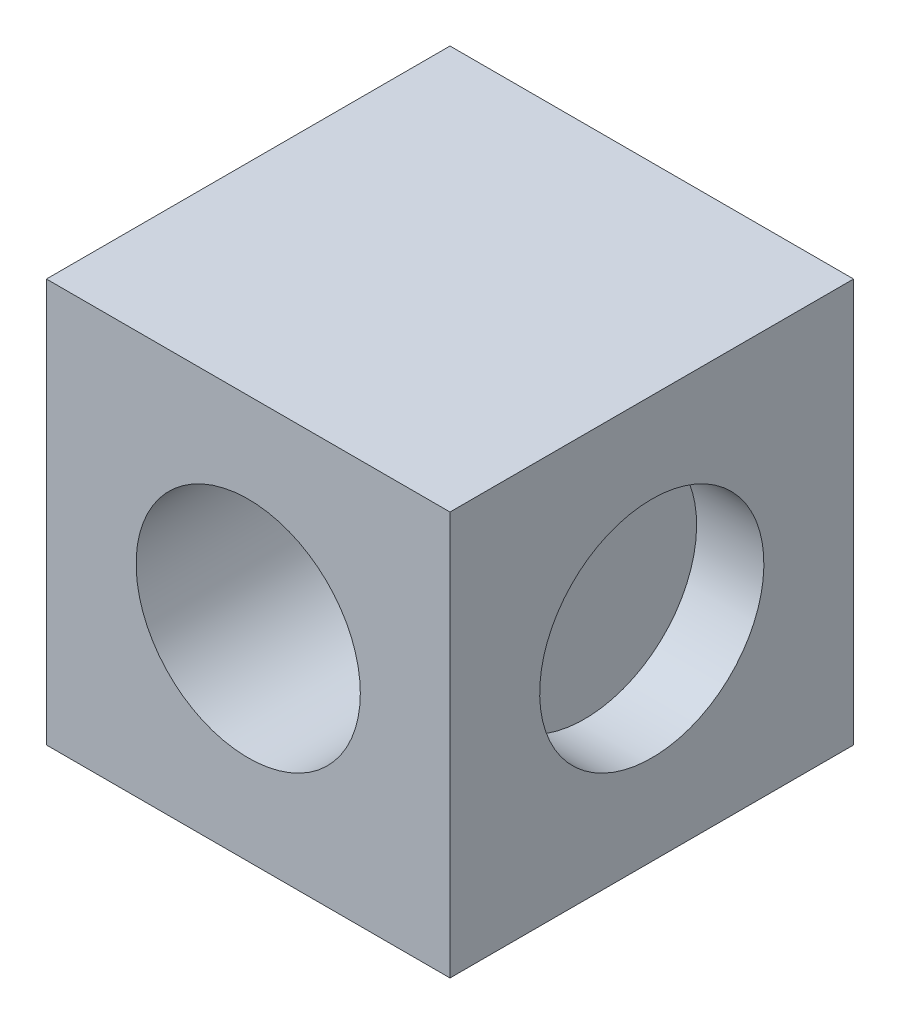
ISO-10303-21;
HEADER;
FILE_DESCRIPTION(('STEP AP214'),'2;1');
FILE_NAME('part.step','',(''),(''),'','','');
FILE_SCHEMA(('AUTOMOTIVE_DESIGN { 1 0 10303 214 1 1 1 1 }'));
ENDSEC;
DATA;
#1=APPLICATION_CONTEXT('core data for automotive mechanical design processes');
#2=APPLICATION_PROTOCOL_DEFINITION('international standard','automotive_design',2000,#1);
#3=PRODUCT_CONTEXT('',#1,'mechanical');
#4=PRODUCT('Part','Part','',(#3));
#5=PRODUCT_RELATED_PRODUCT_CATEGORY('part','',(#4));
#6=PRODUCT_DEFINITION_FORMATION('','',#4);
#7=PRODUCT_DEFINITION_CONTEXT('part definition',#1,'design');
#8=PRODUCT_DEFINITION('design','',#6,#7);
#9=PRODUCT_DEFINITION_SHAPE('','',#8);
#10=(LENGTH_UNIT() NAMED_UNIT(*) SI_UNIT(.MILLI.,.METRE.));
#11=(NAMED_UNIT(*) PLANE_ANGLE_UNIT() SI_UNIT($,.RADIAN.));
#12=(NAMED_UNIT(*) SI_UNIT($,.STERADIAN.) SOLID_ANGLE_UNIT());
#13=UNCERTAINTY_MEASURE_WITH_UNIT(LENGTH_MEASURE(1.E-05),#10,'distance_accuracy_value','');
#14=(GEOMETRIC_REPRESENTATION_CONTEXT(3) GLOBAL_UNCERTAINTY_ASSIGNED_CONTEXT((#13)) GLOBAL_UNIT_ASSIGNED_CONTEXT((#10,
#11,#12)) REPRESENTATION_CONTEXT('',''));
#15=CARTESIAN_POINT('',(0.,0.,0.));
#16=DIRECTION('',(0.,0.,1.));
#17=DIRECTION('',(1.,0.,0.));
#18=AXIS2_PLACEMENT_3D('',#15,#16,#17);
#19=CARTESIAN_POINT('',(0.,0.,18.));
#20=DIRECTION('',(0.,0.,1.));
#21=DIRECTION('',(1.,0.,0.));
#22=AXIS2_PLACEMENT_3D('',#19,#20,#21);
#23=PLANE('',#22);
#24=DIRECTION('',(0.,1.,0.));
#25=VECTOR('',#24,1.);
#26=CARTESIAN_POINT('',(9.,9.,18.));
#27=LINE('',#26,#25);
#28=CARTESIAN_POINT('',(9.,-9.,18.));
#29=VERTEX_POINT('',#28);
#30=CARTESIAN_POINT('',(9.,9.,18.));
#31=VERTEX_POINT('',#30);
#32=EDGE_CURVE('E92',#29,#31,#27,.T.);
#33=ORIENTED_EDGE('',*,*,#32,.T.);
#34=DIRECTION('',(-1.,0.,0.));
#35=VECTOR('',#34,1.);
#36=CARTESIAN_POINT('',(-9.,9.,18.));
#37=LINE('',#36,#35);
#38=CARTESIAN_POINT('',(-9.,9.,18.));
#39=VERTEX_POINT('',#38);
#40=EDGE_CURVE('E87',#31,#39,#37,.T.);
#41=ORIENTED_EDGE('',*,*,#40,.T.);
#42=DIRECTION('',(0.,-1.,0.));
#43=VECTOR('',#42,1.);
#44=CARTESIAN_POINT('',(-9.,9.,18.));
#45=LINE('',#44,#43);
#46=CARTESIAN_POINT('',(-9.,-9.,18.));
#47=VERTEX_POINT('',#46);
#48=EDGE_CURVE('E90',#39,#47,#45,.T.);
#49=ORIENTED_EDGE('',*,*,#48,.T.);
#50=DIRECTION('',(1.,0.,0.));
#51=VECTOR('',#50,1.);
#52=CARTESIAN_POINT('',(-9.,-9.,18.));
#53=LINE('',#52,#51);
#54=EDGE_CURVE('E57',#47,#29,#53,.T.);
#55=ORIENTED_EDGE('',*,*,#54,.T.);
#56=EDGE_LOOP('',(#33,#41,#49,#55));
#57=FACE_BOUND('',#56,.T.);
#58=CARTESIAN_POINT('',(0.,0.,18.));
#59=DIRECTION('',(0.,0.,1.));
#60=DIRECTION('',(1.,0.,0.));
#61=AXIS2_PLACEMENT_3D('',#58,#59,#60);
#62=CIRCLE('',#61,5.);
#63=CARTESIAN_POINT('',(5.,0.,18.));
#64=VERTEX_POINT('',#63);
#65=EDGE_CURVE('E112',#64,#64,#62,.T.);
#66=ORIENTED_EDGE('',*,*,#65,.F.);
#67=EDGE_LOOP('',(#66));
#68=FACE_BOUND('',#67,.T.);
#69=ADVANCED_FACE('F39',(#57,#68),#23,.T.);
#70=CARTESIAN_POINT('',(0.,0.,0.));
#71=DIRECTION('',(0.,0.,1.));
#72=DIRECTION('',(1.,0.,0.));
#73=AXIS2_PLACEMENT_3D('',#70,#71,#72);
#74=PLANE('',#73);
#75=DIRECTION('',(0.,1.,0.));
#76=VECTOR('',#75,1.);
#77=CARTESIAN_POINT('',(9.,9.,0.));
#78=LINE('',#77,#76);
#79=CARTESIAN_POINT('',(9.,-9.,0.));
#80=VERTEX_POINT('',#79);
#81=CARTESIAN_POINT('',(9.,9.,0.));
#82=VERTEX_POINT('',#81);
#83=EDGE_CURVE('E108',#80,#82,#78,.T.);
#84=ORIENTED_EDGE('',*,*,#83,.F.);
#85=DIRECTION('',(1.,0.,0.));
#86=VECTOR('',#85,1.);
#87=CARTESIAN_POINT('',(-9.,-9.,0.));
#88=LINE('',#87,#86);
#89=CARTESIAN_POINT('',(-9.,-9.,0.));
#90=VERTEX_POINT('',#89);
#91=EDGE_CURVE('E80',#90,#80,#88,.T.);
#92=ORIENTED_EDGE('',*,*,#91,.F.);
#93=DIRECTION('',(0.,-1.,0.));
#94=VECTOR('',#93,1.);
#95=CARTESIAN_POINT('',(-9.,9.,0.));
#96=LINE('',#95,#94);
#97=CARTESIAN_POINT('',(-9.,9.,0.));
#98=VERTEX_POINT('',#97);
#99=EDGE_CURVE('E74',#98,#90,#96,.T.);
#100=ORIENTED_EDGE('',*,*,#99,.F.);
#101=DIRECTION('',(-1.,0.,0.));
#102=VECTOR('',#101,1.);
#103=CARTESIAN_POINT('',(-9.,9.,0.));
#104=LINE('',#103,#102);
#105=EDGE_CURVE('E97',#82,#98,#104,.T.);
#106=ORIENTED_EDGE('',*,*,#105,.F.);
#107=EDGE_LOOP('',(#84,#92,#100,#106));
#108=FACE_BOUND('',#107,.T.);
#109=CARTESIAN_POINT('',(0.,0.,0.));
#110=DIRECTION('',(0.,0.,1.));
#111=DIRECTION('',(1.,0.,0.));
#112=AXIS2_PLACEMENT_3D('',#109,#110,#111);
#113=CIRCLE('',#112,5.);
#114=CARTESIAN_POINT('',(5.,0.,0.));
#115=VERTEX_POINT('',#114);
#116=EDGE_CURVE('E130',#115,#115,#113,.T.);
#117=ORIENTED_EDGE('',*,*,#116,.T.);
#118=EDGE_LOOP('',(#117));
#119=FACE_BOUND('',#118,.T.);
#120=ADVANCED_FACE('F125',(#108,#119),#74,.F.);
#121=CARTESIAN_POINT('',(9.,9.,18.));
#122=DIRECTION('',(-1.,0.,0.));
#123=DIRECTION('',(0.,-1.,0.));
#124=AXIS2_PLACEMENT_3D('',#121,#122,#123);
#125=PLANE('',#124);
#126=CARTESIAN_POINT('',(9.,0.,9.));
#127=DIRECTION('',(1.,0.,0.));
#128=DIRECTION('',(0.,1.,0.));
#129=AXIS2_PLACEMENT_3D('',#126,#127,#128);
#130=CIRCLE('',#129,5.);
#131=CARTESIAN_POINT('',(9.,5.,9.));
#132=VERTEX_POINT('',#131);
#133=EDGE_CURVE('E138',#132,#132,#130,.T.);
#134=ORIENTED_EDGE('',*,*,#133,.F.);
#135=EDGE_LOOP('',(#134));
#136=FACE_BOUND('',#135,.T.);
#137=ORIENTED_EDGE('',*,*,#83,.T.);
#138=DIRECTION('',(0.,0.,-1.));
#139=VECTOR('',#138,1.);
#140=CARTESIAN_POINT('',(9.,9.,18.));
#141=LINE('',#140,#139);
#142=EDGE_CURVE('E11',#31,#82,#141,.T.);
#143=ORIENTED_EDGE('',*,*,#142,.F.);
#144=ORIENTED_EDGE('',*,*,#32,.F.);
#145=DIRECTION('',(0.,0.,-1.));
#146=VECTOR('',#145,1.);
#147=CARTESIAN_POINT('',(9.,-9.,18.));
#148=LINE('',#147,#146);
#149=EDGE_CURVE('E104',#29,#80,#148,.T.);
#150=ORIENTED_EDGE('',*,*,#149,.T.);
#151=EDGE_LOOP('',(#137,#143,#144,#150));
#152=FACE_BOUND('',#151,.T.);
#153=ADVANCED_FACE('F41',(#136,#152),#125,.F.);
#154=CARTESIAN_POINT('',(-9.,9.,18.));
#155=DIRECTION('',(0.,-1.,0.));
#156=DIRECTION('',(0.,0.,-1.));
#157=AXIS2_PLACEMENT_3D('',#154,#155,#156);
#158=PLANE('',#157);
#159=ORIENTED_EDGE('',*,*,#105,.T.);
#160=DIRECTION('',(0.,0.,-1.));
#161=VECTOR('',#160,1.);
#162=CARTESIAN_POINT('',(-9.,9.,18.));
#163=LINE('',#162,#161);
#164=EDGE_CURVE('E49',#39,#98,#163,.T.);
#165=ORIENTED_EDGE('',*,*,#164,.F.);
#166=ORIENTED_EDGE('',*,*,#40,.F.);
#167=ORIENTED_EDGE('',*,*,#142,.T.);
#168=EDGE_LOOP('',(#159,#165,#166,#167));
#169=FACE_BOUND('',#168,.T.);
#170=ADVANCED_FACE('F96',(#169),#158,.F.);
#171=CARTESIAN_POINT('',(-9.,9.,18.));
#172=DIRECTION('',(1.,0.,0.));
#173=DIRECTION('',(0.,1.,0.));
#174=AXIS2_PLACEMENT_3D('',#171,#172,#173);
#175=PLANE('',#174);
#176=CARTESIAN_POINT('',(-9.,0.,9.));
#177=DIRECTION('',(1.,0.,0.));
#178=DIRECTION('',(0.,1.,0.));
#179=AXIS2_PLACEMENT_3D('',#176,#177,#178);
#180=CIRCLE('',#179,5.);
#181=CARTESIAN_POINT('',(-9.,5.,9.));
#182=VERTEX_POINT('',#181);
#183=EDGE_CURVE('E146',#182,#182,#180,.T.);
#184=ORIENTED_EDGE('',*,*,#183,.T.);
#185=EDGE_LOOP('',(#184));
#186=FACE_BOUND('',#185,.T.);
#187=ORIENTED_EDGE('',*,*,#99,.T.);
#188=DIRECTION('',(0.,0.,-1.));
#189=VECTOR('',#188,1.);
#190=CARTESIAN_POINT('',(-9.,-9.,18.));
#191=LINE('',#190,#189);
#192=EDGE_CURVE('E99',#47,#90,#191,.T.);
#193=ORIENTED_EDGE('',*,*,#192,.F.);
#194=ORIENTED_EDGE('',*,*,#48,.F.);
#195=ORIENTED_EDGE('',*,*,#164,.T.);
#196=EDGE_LOOP('',(#187,#193,#194,#195));
#197=FACE_BOUND('',#196,.T.);
#198=ADVANCED_FACE('F100',(#186,#197),#175,.F.);
#199=CARTESIAN_POINT('',(-9.,-9.,18.));
#200=DIRECTION('',(0.,1.,0.));
#201=DIRECTION('',(0.,0.,1.));
#202=AXIS2_PLACEMENT_3D('',#199,#200,#201);
#203=PLANE('',#202);
#204=ORIENTED_EDGE('',*,*,#91,.T.);
#205=ORIENTED_EDGE('',*,*,#149,.F.);
#206=ORIENTED_EDGE('',*,*,#54,.F.);
#207=ORIENTED_EDGE('',*,*,#192,.T.);
#208=EDGE_LOOP('',(#204,#205,#206,#207));
#209=FACE_BOUND('',#208,.T.);
#210=ADVANCED_FACE('F122',(#209),#203,.F.);
#211=CARTESIAN_POINT('',(0.,0.,18.));
#212=DIRECTION('',(0.,0.,-1.));
#213=DIRECTION('',(-1.,0.,0.));
#214=AXIS2_PLACEMENT_3D('',#211,#212,#213);
#215=CYLINDRICAL_SURFACE('',#214,5.);
#216=ORIENTED_EDGE('',*,*,#65,.T.);
#217=EDGE_LOOP('',(#216));
#218=FACE_BOUND('',#217,.T.);
#219=ORIENTED_EDGE('',*,*,#116,.F.);
#220=EDGE_LOOP('',(#219));
#221=FACE_BOUND('',#220,.T.);
#222=ADVANCED_FACE('F172',(#218,#221),#215,.F.);
#223=CARTESIAN_POINT('',(6.,0.,9.));
#224=DIRECTION('',(1.,0.,0.));
#225=DIRECTION('',(0.,1.,0.));
#226=AXIS2_PLACEMENT_3D('',#223,#224,#225);
#227=CYLINDRICAL_SURFACE('',#226,5.);
#228=CARTESIAN_POINT('',(6.,0.,9.));
#229=DIRECTION('',(1.,0.,0.));
#230=DIRECTION('',(0.,1.,0.));
#231=AXIS2_PLACEMENT_3D('',#228,#229,#230);
#232=CIRCLE('',#231,5.);
#233=CARTESIAN_POINT('',(6.,5.,9.));
#234=VERTEX_POINT('',#233);
#235=EDGE_CURVE('E134',#234,#234,#232,.T.);
#236=ORIENTED_EDGE('',*,*,#235,.F.);
#237=EDGE_LOOP('',(#236));
#238=FACE_BOUND('',#237,.T.);
#239=ORIENTED_EDGE('',*,*,#133,.T.);
#240=EDGE_LOOP('',(#239));
#241=FACE_BOUND('',#240,.T.);
#242=ADVANCED_FACE('F188',(#238,#241),#227,.F.);
#243=CARTESIAN_POINT('',(6.,0.,9.));
#244=DIRECTION('',(1.,0.,0.));
#245=DIRECTION('',(0.,1.,0.));
#246=AXIS2_PLACEMENT_3D('',#243,#244,#245);
#247=PLANE('',#246);
#248=ORIENTED_EDGE('',*,*,#235,.T.);
#249=EDGE_LOOP('',(#248));
#250=FACE_BOUND('',#249,.T.);
#251=ADVANCED_FACE('F163',(#250),#247,.T.);
#252=CARTESIAN_POINT('',(-6.,0.,9.));
#253=DIRECTION('',(-1.,0.,0.));
#254=DIRECTION('',(0.,-1.,0.));
#255=AXIS2_PLACEMENT_3D('',#252,#253,#254);
#256=CYLINDRICAL_SURFACE('',#255,5.);
#257=CARTESIAN_POINT('',(-6.,0.,9.));
#258=DIRECTION('',(1.,0.,0.));
#259=DIRECTION('',(0.,1.,0.));
#260=AXIS2_PLACEMENT_3D('',#257,#258,#259);
#261=CIRCLE('',#260,5.);
#262=CARTESIAN_POINT('',(-6.,5.,9.));
#263=VERTEX_POINT('',#262);
#264=EDGE_CURVE('E142',#263,#263,#261,.T.);
#265=ORIENTED_EDGE('',*,*,#264,.T.);
#266=EDGE_LOOP('',(#265));
#267=FACE_BOUND('',#266,.T.);
#268=ORIENTED_EDGE('',*,*,#183,.F.);
#269=EDGE_LOOP('',(#268));
#270=FACE_BOUND('',#269,.T.);
#271=ADVANCED_FACE('F154',(#267,#270),#256,.F.);
#272=CARTESIAN_POINT('',(-6.,0.,9.));
#273=DIRECTION('',(-1.,0.,0.));
#274=DIRECTION('',(0.,1.,0.));
#275=AXIS2_PLACEMENT_3D('',#272,#273,#274);
#276=PLANE('',#275);
#277=ORIENTED_EDGE('',*,*,#264,.F.);
#278=EDGE_LOOP('',(#277));
#279=FACE_BOUND('',#278,.T.);
#280=ADVANCED_FACE('F157',(#279),#276,.T.);
#281=CLOSED_SHELL('',(#69,#120,#153,#170,#198,#210,#222,#242,#251,#271,#280));
#282=MANIFOLD_SOLID_BREP('B2',#281);
#283=ADVANCED_BREP_SHAPE_REPRESENTATION('',(#18,#282),#14);
#284=SHAPE_DEFINITION_REPRESENTATION(#9,#283);
ENDSEC;
END-ISO-10303-21;
